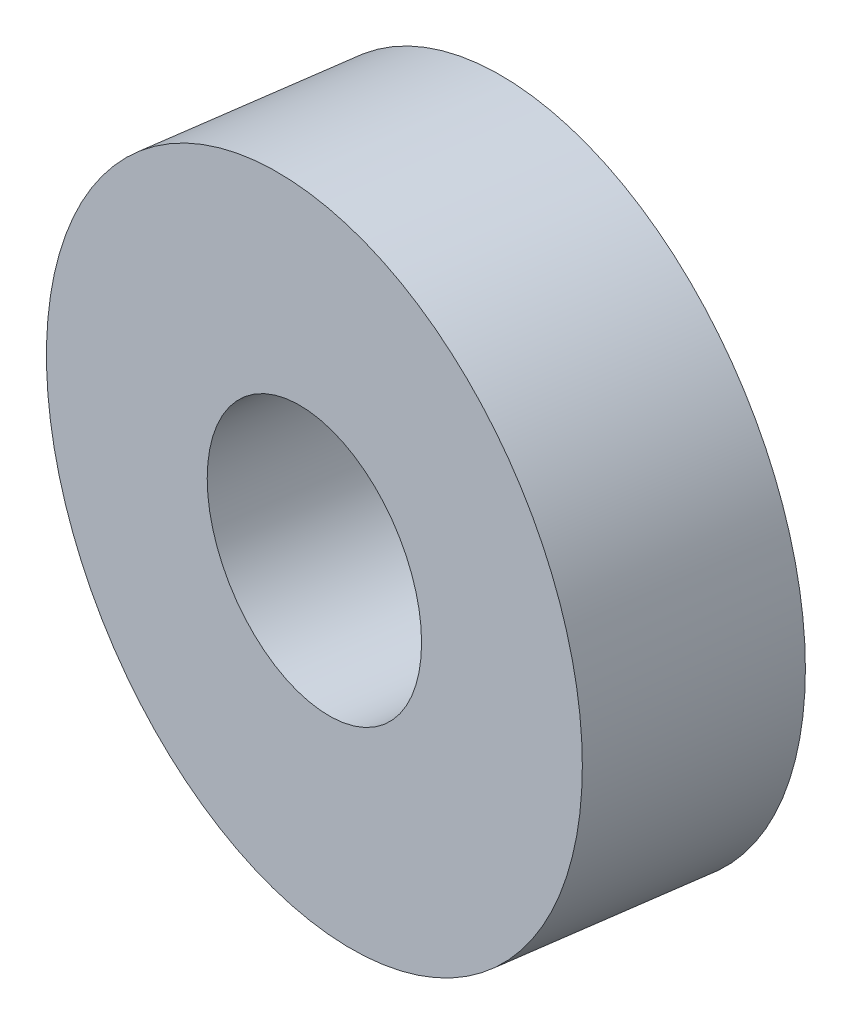
ISO-10303-21;
HEADER;
FILE_DESCRIPTION(('STEP AP214'),'2;1');
FILE_NAME('part.step','',(''),(''),'','','');
FILE_SCHEMA(('AUTOMOTIVE_DESIGN { 1 0 10303 214 1 1 1 1 }'));
ENDSEC;
DATA;
#1=APPLICATION_CONTEXT('core data for automotive mechanical design processes');
#2=APPLICATION_PROTOCOL_DEFINITION('international standard','automotive_design',2000,#1);
#3=PRODUCT_CONTEXT('',#1,'mechanical');
#4=PRODUCT('Part','Part','',(#3));
#5=PRODUCT_RELATED_PRODUCT_CATEGORY('part','',(#4));
#6=PRODUCT_DEFINITION_FORMATION('','',#4);
#7=PRODUCT_DEFINITION_CONTEXT('part definition',#1,'design');
#8=PRODUCT_DEFINITION('design','',#6,#7);
#9=PRODUCT_DEFINITION_SHAPE('','',#8);
#10=(LENGTH_UNIT() NAMED_UNIT(*) SI_UNIT(.MILLI.,.METRE.));
#11=(NAMED_UNIT(*) PLANE_ANGLE_UNIT() SI_UNIT($,.RADIAN.));
#12=(NAMED_UNIT(*) SI_UNIT($,.STERADIAN.) SOLID_ANGLE_UNIT());
#13=UNCERTAINTY_MEASURE_WITH_UNIT(LENGTH_MEASURE(1.E-05),#10,'distance_accuracy_value','');
#14=(GEOMETRIC_REPRESENTATION_CONTEXT(3) GLOBAL_UNCERTAINTY_ASSIGNED_CONTEXT((#13)) GLOBAL_UNIT_ASSIGNED_CONTEXT((#10,
#11,#12)) REPRESENTATION_CONTEXT('',''));
#15=CARTESIAN_POINT('',(0.,0.,0.));
#16=DIRECTION('',(0.,0.,1.));
#17=DIRECTION('',(1.,0.,0.));
#18=AXIS2_PLACEMENT_3D('',#15,#16,#17);
#19=CARTESIAN_POINT('',(-23.1740545998007,-11.1359051601428,-12.2414702936052));
#20=DIRECTION('',(-0.139254831399095,0.,0.990256578838035));
#21=DIRECTION('',(0.990256578838035,0.,0.139254831399095));
#22=AXIS2_PLACEMENT_3D('',#19,#20,#21);
#23=CYLINDRICAL_SURFACE('',#22,3.175);
#24=CARTESIAN_POINT('',(-22.4807883471634,-11.1359051601428,-17.1713636456924));
#25=DIRECTION('',(-0.139254831399095,0.,0.990256578838035));
#26=DIRECTION('',(0.990256578838035,0.,0.139254831399095));
#27=AXIS2_PLACEMENT_3D('',#24,#25,#26);
#28=CIRCLE('',#27,3.175);
#29=CARTESIAN_POINT('',(-19.3367237093526,-11.1359051601428,-16.7292295560003));
#30=VERTEX_POINT('',#29);
#31=EDGE_CURVE('E44',#30,#30,#28,.T.);
#32=ORIENTED_EDGE('',*,*,#31,.F.);
#33=EDGE_LOOP('',(#32));
#34=FACE_BOUND('',#33,.T.);
#35=CARTESIAN_POINT('',(-23.1740545998007,-11.1359051601428,-12.2414702936052));
#36=DIRECTION('',(-0.139254831399095,0.,0.990256578838035));
#37=DIRECTION('',(0.990256578838035,0.,0.139254831399095));
#38=AXIS2_PLACEMENT_3D('',#35,#36,#37);
#39=CIRCLE('',#38,3.175);
#40=CARTESIAN_POINT('',(-20.0299899619899,-11.1359051601428,-11.799336203913));
#41=VERTEX_POINT('',#40);
#42=EDGE_CURVE('E10',#41,#41,#39,.T.);
#43=ORIENTED_EDGE('',*,*,#42,.T.);
#44=EDGE_LOOP('',(#43));
#45=FACE_BOUND('',#44,.T.);
#46=ADVANCED_FACE('F30',(#34,#45),#23,.F.);
#47=CARTESIAN_POINT('',(-23.1740545998007,0.,-12.2414702936052));
#48=DIRECTION('',(-0.139254831399095,0.,0.990256578838035));
#49=DIRECTION('',(0.990256578838035,0.,0.139254831399095));
#50=AXIS2_PLACEMENT_3D('',#47,#48,#49);
#51=PLANE('',#50);
#52=CARTESIAN_POINT('',(-23.1740545998007,-11.1359051601428,-12.2414702936052));
#53=DIRECTION('',(-0.139254831399095,0.,0.990256578838035));
#54=DIRECTION('',(0.990256578838035,0.,0.139254831399095));
#55=AXIS2_PLACEMENT_3D('',#52,#53,#54);
#56=CIRCLE('',#55,7.9375);
#57=CARTESIAN_POINT('',(-15.3138930052738,-11.1359051601428,-11.1361350693748));
#58=VERTEX_POINT('',#57);
#59=EDGE_CURVE('E36',#58,#58,#56,.T.);
#60=ORIENTED_EDGE('',*,*,#59,.T.);
#61=EDGE_LOOP('',(#60));
#62=FACE_BOUND('',#61,.T.);
#63=ORIENTED_EDGE('',*,*,#42,.F.);
#64=EDGE_LOOP('',(#63));
#65=FACE_BOUND('',#64,.T.);
#66=ADVANCED_FACE('F53',(#62,#65),#51,.T.);
#67=CARTESIAN_POINT('',(-23.1740545998007,-11.1359051601428,-12.2414702936052));
#68=DIRECTION('',(-0.139254831399095,0.,0.990256578838035));
#69=DIRECTION('',(0.990256578838035,0.,0.139254831399095));
#70=AXIS2_PLACEMENT_3D('',#67,#68,#69);
#71=CYLINDRICAL_SURFACE('',#70,7.9375);
#72=CARTESIAN_POINT('',(-22.4807883471634,-11.1359051601428,-17.1713636456925));
#73=DIRECTION('',(-0.139254831399095,0.,0.990256578838035));
#74=DIRECTION('',(0.990256578838035,0.,0.139254831399095));
#75=AXIS2_PLACEMENT_3D('',#72,#73,#74);
#76=CIRCLE('',#75,7.9375);
#77=CARTESIAN_POINT('',(-14.6206267526365,-11.1359051601428,-16.0660284214621));
#78=VERTEX_POINT('',#77);
#79=EDGE_CURVE('E40',#78,#78,#76,.T.);
#80=ORIENTED_EDGE('',*,*,#79,.T.);
#81=EDGE_LOOP('',(#80));
#82=FACE_BOUND('',#81,.T.);
#83=ORIENTED_EDGE('',*,*,#59,.F.);
#84=EDGE_LOOP('',(#83));
#85=FACE_BOUND('',#84,.T.);
#86=ADVANCED_FACE('F57',(#82,#85),#71,.T.);
#87=CARTESIAN_POINT('',(-22.4807883471634,0.,-17.1713636456925));
#88=DIRECTION('',(-0.139254831399095,0.,0.990256578838035));
#89=DIRECTION('',(0.990256578838035,0.,0.139254831399095));
#90=AXIS2_PLACEMENT_3D('',#87,#88,#89);
#91=PLANE('',#90);
#92=ORIENTED_EDGE('',*,*,#79,.F.);
#93=EDGE_LOOP('',(#92));
#94=FACE_BOUND('',#93,.T.);
#95=ORIENTED_EDGE('',*,*,#31,.T.);
#96=EDGE_LOOP('',(#95));
#97=FACE_BOUND('',#96,.T.);
#98=ADVANCED_FACE('F50',(#94,#97),#91,.F.);
#99=CLOSED_SHELL('',(#46,#66,#86,#98));
#100=MANIFOLD_SOLID_BREP('B2',#99);
#101=ADVANCED_BREP_SHAPE_REPRESENTATION('',(#18,#100),#14);
#102=SHAPE_DEFINITION_REPRESENTATION(#9,#101);
ENDSEC;
END-ISO-10303-21;
